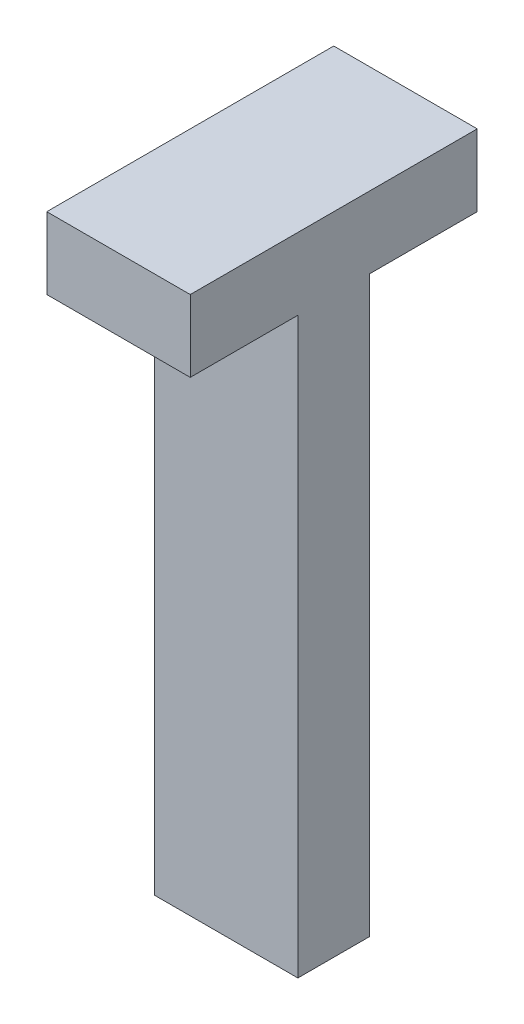
ISO-10303-21;
HEADER;
FILE_DESCRIPTION(('STEP AP214'),'2;1');
FILE_NAME('part.step','',(''),(''),'','','');
FILE_SCHEMA(('AUTOMOTIVE_DESIGN { 1 0 10303 214 1 1 1 1 }'));
ENDSEC;
DATA;
#1=APPLICATION_CONTEXT('core data for automotive mechanical design processes');
#2=APPLICATION_PROTOCOL_DEFINITION('international standard','automotive_design',2000,#1);
#3=PRODUCT_CONTEXT('',#1,'mechanical');
#4=PRODUCT('Part','Part','',(#3));
#5=PRODUCT_RELATED_PRODUCT_CATEGORY('part','',(#4));
#6=PRODUCT_DEFINITION_FORMATION('','',#4);
#7=PRODUCT_DEFINITION_CONTEXT('part definition',#1,'design');
#8=PRODUCT_DEFINITION('design','',#6,#7);
#9=PRODUCT_DEFINITION_SHAPE('','',#8);
#10=(LENGTH_UNIT() NAMED_UNIT(*) SI_UNIT(.MILLI.,.METRE.));
#11=(NAMED_UNIT(*) PLANE_ANGLE_UNIT() SI_UNIT($,.RADIAN.));
#12=(NAMED_UNIT(*) SI_UNIT($,.STERADIAN.) SOLID_ANGLE_UNIT());
#13=UNCERTAINTY_MEASURE_WITH_UNIT(LENGTH_MEASURE(1.E-05),#10,'distance_accuracy_value','');
#14=(GEOMETRIC_REPRESENTATION_CONTEXT(3) GLOBAL_UNCERTAINTY_ASSIGNED_CONTEXT((#13)) GLOBAL_UNIT_ASSIGNED_CONTEXT((#10,
#11,#12)) REPRESENTATION_CONTEXT('',''));
#15=CARTESIAN_POINT('',(0.,0.,0.));
#16=DIRECTION('',(0.,0.,1.));
#17=DIRECTION('',(1.,0.,0.));
#18=AXIS2_PLACEMENT_3D('',#15,#16,#17);
#19=CARTESIAN_POINT('',(20.,-9.99999999999999,0.));
#20=DIRECTION('',(0.,0.,1.));
#21=DIRECTION('',(1.,0.,0.));
#22=AXIS2_PLACEMENT_3D('',#19,#20,#21);
#23=PLANE('',#22);
#24=DIRECTION('',(0.,1.,0.));
#25=VECTOR('',#24,1.);
#26=CARTESIAN_POINT('',(0.,-9.99999999999999,0.));
#27=LINE('',#26,#25);
#28=CARTESIAN_POINT('',(0.,-9.99999999999999,0.));
#29=VERTEX_POINT('',#28);
#30=CARTESIAN_POINT('',(0.,0.,0.));
#31=VERTEX_POINT('',#30);
#32=EDGE_CURVE('E197',#29,#31,#27,.T.);
#33=ORIENTED_EDGE('',*,*,#32,.T.);
#34=DIRECTION('',(-1.,0.,0.));
#35=VECTOR('',#34,1.);
#36=CARTESIAN_POINT('',(20.,0.,0.));
#37=LINE('',#36,#35);
#38=CARTESIAN_POINT('',(20.,0.,0.));
#39=VERTEX_POINT('',#38);
#40=EDGE_CURVE('E12',#39,#31,#37,.T.);
#41=ORIENTED_EDGE('',*,*,#40,.F.);
#42=DIRECTION('',(0.,1.,0.));
#43=VECTOR('',#42,1.);
#44=CARTESIAN_POINT('',(20.,-9.99999999999999,0.));
#45=LINE('',#44,#43);
#46=CARTESIAN_POINT('',(20.,-9.99999999999999,0.));
#47=VERTEX_POINT('',#46);
#48=EDGE_CURVE('E170',#47,#39,#45,.T.);
#49=ORIENTED_EDGE('',*,*,#48,.F.);
#50=DIRECTION('',(-1.,0.,0.));
#51=VECTOR('',#50,1.);
#52=CARTESIAN_POINT('',(20.,-9.99999999999999,0.));
#53=LINE('',#52,#51);
#54=EDGE_CURVE('E146',#47,#29,#53,.T.);
#55=ORIENTED_EDGE('',*,*,#54,.T.);
#56=EDGE_LOOP('',(#33,#41,#49,#55));
#57=FACE_BOUND('',#56,.T.);
#58=ADVANCED_FACE('F50',(#57),#23,.F.);
#59=CARTESIAN_POINT('',(20.,0.,0.));
#60=DIRECTION('',(0.,-1.,0.));
#61=DIRECTION('',(0.,0.,-1.));
#62=AXIS2_PLACEMENT_3D('',#59,#60,#61);
#63=PLANE('',#62);
#64=DIRECTION('',(0.,0.,1.));
#65=VECTOR('',#64,1.);
#66=CARTESIAN_POINT('',(0.,0.,0.));
#67=LINE('',#66,#65);
#68=CARTESIAN_POINT('',(0.,0.,40.));
#69=VERTEX_POINT('',#68);
#70=EDGE_CURVE('E192',#31,#69,#67,.T.);
#71=ORIENTED_EDGE('',*,*,#70,.T.);
#72=DIRECTION('',(-1.,0.,0.));
#73=VECTOR('',#72,1.);
#74=CARTESIAN_POINT('',(20.,0.,40.));
#75=LINE('',#74,#73);
#76=CARTESIAN_POINT('',(20.,0.,40.));
#77=VERTEX_POINT('',#76);
#78=EDGE_CURVE('E59',#77,#69,#75,.T.);
#79=ORIENTED_EDGE('',*,*,#78,.F.);
#80=DIRECTION('',(0.,0.,1.));
#81=VECTOR('',#80,1.);
#82=CARTESIAN_POINT('',(20.,0.,0.));
#83=LINE('',#82,#81);
#84=EDGE_CURVE('E110',#39,#77,#83,.T.);
#85=ORIENTED_EDGE('',*,*,#84,.F.);
#86=ORIENTED_EDGE('',*,*,#40,.T.);
#87=EDGE_LOOP('',(#71,#79,#85,#86));
#88=FACE_BOUND('',#87,.T.);
#89=ADVANCED_FACE('F230',(#88),#63,.F.);
#90=CARTESIAN_POINT('',(20.,0.,40.));
#91=DIRECTION('',(0.,0.,-1.));
#92=DIRECTION('',(-1.,0.,0.));
#93=AXIS2_PLACEMENT_3D('',#90,#91,#92);
#94=PLANE('',#93);
#95=DIRECTION('',(0.,-1.,0.));
#96=VECTOR('',#95,1.);
#97=CARTESIAN_POINT('',(0.,0.,40.));
#98=LINE('',#97,#96);
#99=CARTESIAN_POINT('',(0.,-10.,40.));
#100=VERTEX_POINT('',#99);
#101=EDGE_CURVE('E196',#69,#100,#98,.T.);
#102=ORIENTED_EDGE('',*,*,#101,.T.);
#103=DIRECTION('',(-1.,0.,0.));
#104=VECTOR('',#103,1.);
#105=CARTESIAN_POINT('',(20.,-10.,40.));
#106=LINE('',#105,#104);
#107=CARTESIAN_POINT('',(20.,-10.,40.));
#108=VERTEX_POINT('',#107);
#109=EDGE_CURVE('E182',#108,#100,#106,.T.);
#110=ORIENTED_EDGE('',*,*,#109,.F.);
#111=DIRECTION('',(0.,-1.,0.));
#112=VECTOR('',#111,1.);
#113=CARTESIAN_POINT('',(20.,0.,40.));
#114=LINE('',#113,#112);
#115=EDGE_CURVE('E310',#77,#108,#114,.T.);
#116=ORIENTED_EDGE('',*,*,#115,.F.);
#117=ORIENTED_EDGE('',*,*,#78,.T.);
#118=EDGE_LOOP('',(#102,#110,#116,#117));
#119=FACE_BOUND('',#118,.T.);
#120=ADVANCED_FACE('F234',(#119),#94,.F.);
#121=CARTESIAN_POINT('',(20.,-10.,40.));
#122=DIRECTION('',(0.,1.,0.));
#123=DIRECTION('',(0.,0.,1.));
#124=AXIS2_PLACEMENT_3D('',#121,#122,#123);
#125=PLANE('',#124);
#126=DIRECTION('',(0.,0.,-1.));
#127=VECTOR('',#126,1.);
#128=CARTESIAN_POINT('',(0.,-10.,40.));
#129=LINE('',#128,#127);
#130=CARTESIAN_POINT('',(0.,-10.,25.));
#131=VERTEX_POINT('',#130);
#132=EDGE_CURVE('E199',#100,#131,#129,.T.);
#133=ORIENTED_EDGE('',*,*,#132,.T.);
#134=DIRECTION('',(-1.,0.,0.));
#135=VECTOR('',#134,1.);
#136=CARTESIAN_POINT('',(20.,-10.,25.));
#137=LINE('',#136,#135);
#138=CARTESIAN_POINT('',(20.,-10.,25.));
#139=VERTEX_POINT('',#138);
#140=EDGE_CURVE('E178',#139,#131,#137,.T.);
#141=ORIENTED_EDGE('',*,*,#140,.F.);
#142=DIRECTION('',(0.,0.,-1.));
#143=VECTOR('',#142,1.);
#144=CARTESIAN_POINT('',(20.,-10.,40.));
#145=LINE('',#144,#143);
#146=EDGE_CURVE('E313',#108,#139,#145,.T.);
#147=ORIENTED_EDGE('',*,*,#146,.F.);
#148=ORIENTED_EDGE('',*,*,#109,.T.);
#149=EDGE_LOOP('',(#133,#141,#147,#148));
#150=FACE_BOUND('',#149,.T.);
#151=ADVANCED_FACE('F238',(#150),#125,.F.);
#152=CARTESIAN_POINT('',(20.,-10.,25.));
#153=DIRECTION('',(0.,0.,-1.));
#154=DIRECTION('',(-1.,0.,0.));
#155=AXIS2_PLACEMENT_3D('',#152,#153,#154);
#156=PLANE('',#155);
#157=DIRECTION('',(0.,-1.,0.));
#158=VECTOR('',#157,1.);
#159=CARTESIAN_POINT('',(0.,-10.,25.));
#160=LINE('',#159,#158);
#161=CARTESIAN_POINT('',(0.,-90.,25.));
#162=VERTEX_POINT('',#161);
#163=EDGE_CURVE('E163',#131,#162,#160,.T.);
#164=ORIENTED_EDGE('',*,*,#163,.T.);
#165=DIRECTION('',(-1.,0.,0.));
#166=VECTOR('',#165,1.);
#167=CARTESIAN_POINT('',(20.,-90.,25.));
#168=LINE('',#167,#166);
#169=CARTESIAN_POINT('',(20.,-90.,25.));
#170=VERTEX_POINT('',#169);
#171=EDGE_CURVE('E139',#170,#162,#168,.T.);
#172=ORIENTED_EDGE('',*,*,#171,.F.);
#173=DIRECTION('',(0.,-1.,0.));
#174=VECTOR('',#173,1.);
#175=CARTESIAN_POINT('',(20.,-10.,25.));
#176=LINE('',#175,#174);
#177=EDGE_CURVE('E129',#139,#170,#176,.T.);
#178=ORIENTED_EDGE('',*,*,#177,.F.);
#179=ORIENTED_EDGE('',*,*,#140,.T.);
#180=EDGE_LOOP('',(#164,#172,#178,#179));
#181=FACE_BOUND('',#180,.T.);
#182=ADVANCED_FACE('F207',(#181),#156,.F.);
#183=CARTESIAN_POINT('',(20.,-90.,25.));
#184=DIRECTION('',(0.,1.,0.));
#185=DIRECTION('',(0.,0.,1.));
#186=AXIS2_PLACEMENT_3D('',#183,#184,#185);
#187=PLANE('',#186);
#188=DIRECTION('',(0.,0.,-1.));
#189=VECTOR('',#188,1.);
#190=CARTESIAN_POINT('',(0.,-90.,25.));
#191=LINE('',#190,#189);
#192=CARTESIAN_POINT('',(0.,-90.,15.));
#193=VERTEX_POINT('',#192);
#194=EDGE_CURVE('E137',#162,#193,#191,.T.);
#195=ORIENTED_EDGE('',*,*,#194,.T.);
#196=DIRECTION('',(-1.,0.,0.));
#197=VECTOR('',#196,1.);
#198=CARTESIAN_POINT('',(20.,-90.,15.));
#199=LINE('',#198,#197);
#200=CARTESIAN_POINT('',(20.,-90.,15.));
#201=VERTEX_POINT('',#200);
#202=EDGE_CURVE('E134',#201,#193,#199,.T.);
#203=ORIENTED_EDGE('',*,*,#202,.F.);
#204=DIRECTION('',(0.,0.,-1.));
#205=VECTOR('',#204,1.);
#206=CARTESIAN_POINT('',(20.,-90.,25.));
#207=LINE('',#206,#205);
#208=EDGE_CURVE('E123',#170,#201,#207,.T.);
#209=ORIENTED_EDGE('',*,*,#208,.F.);
#210=ORIENTED_EDGE('',*,*,#171,.T.);
#211=EDGE_LOOP('',(#195,#203,#209,#210));
#212=FACE_BOUND('',#211,.T.);
#213=ADVANCED_FACE('F135',(#212),#187,.F.);
#214=CARTESIAN_POINT('',(20.,-90.,15.));
#215=DIRECTION('',(0.,0.,1.));
#216=DIRECTION('',(1.,0.,0.));
#217=AXIS2_PLACEMENT_3D('',#214,#215,#216);
#218=PLANE('',#217);
#219=DIRECTION('',(0.,1.,0.));
#220=VECTOR('',#219,1.);
#221=CARTESIAN_POINT('',(0.,-90.,15.));
#222=LINE('',#221,#220);
#223=CARTESIAN_POINT('',(0.,-10.,15.));
#224=VERTEX_POINT('',#223);
#225=EDGE_CURVE('E96',#193,#224,#222,.T.);
#226=ORIENTED_EDGE('',*,*,#225,.T.);
#227=DIRECTION('',(-1.,0.,0.));
#228=VECTOR('',#227,1.);
#229=CARTESIAN_POINT('',(20.,-10.,15.));
#230=LINE('',#229,#228);
#231=CARTESIAN_POINT('',(20.,-10.,15.));
#232=VERTEX_POINT('',#231);
#233=EDGE_CURVE('E140',#232,#224,#230,.T.);
#234=ORIENTED_EDGE('',*,*,#233,.F.);
#235=DIRECTION('',(0.,1.,0.));
#236=VECTOR('',#235,1.);
#237=CARTESIAN_POINT('',(20.,-90.,15.));
#238=LINE('',#237,#236);
#239=EDGE_CURVE('E127',#201,#232,#238,.T.);
#240=ORIENTED_EDGE('',*,*,#239,.F.);
#241=ORIENTED_EDGE('',*,*,#202,.T.);
#242=EDGE_LOOP('',(#226,#234,#240,#241));
#243=FACE_BOUND('',#242,.T.);
#244=ADVANCED_FACE('F142',(#243),#218,.F.);
#245=CARTESIAN_POINT('',(20.,-10.,15.));
#246=DIRECTION('',(0.,1.,0.));
#247=DIRECTION('',(0.,0.,1.));
#248=AXIS2_PLACEMENT_3D('',#245,#246,#247);
#249=PLANE('',#248);
#250=DIRECTION('',(0.,0.,-1.));
#251=VECTOR('',#250,1.);
#252=CARTESIAN_POINT('',(0.,-10.,15.));
#253=LINE('',#252,#251);
#254=EDGE_CURVE('E102',#224,#29,#253,.T.);
#255=ORIENTED_EDGE('',*,*,#254,.T.);
#256=ORIENTED_EDGE('',*,*,#54,.F.);
#257=DIRECTION('',(0.,0.,-1.));
#258=VECTOR('',#257,1.);
#259=CARTESIAN_POINT('',(20.,-10.,15.));
#260=LINE('',#259,#258);
#261=EDGE_CURVE('E67',#232,#47,#260,.T.);
#262=ORIENTED_EDGE('',*,*,#261,.F.);
#263=ORIENTED_EDGE('',*,*,#233,.T.);
#264=EDGE_LOOP('',(#255,#256,#262,#263));
#265=FACE_BOUND('',#264,.T.);
#266=ADVANCED_FACE('F217',(#265),#249,.F.);
#267=CARTESIAN_POINT('',(20.,0.,0.));
#268=DIRECTION('',(1.,0.,0.));
#269=DIRECTION('',(0.,0.,-1.));
#270=AXIS2_PLACEMENT_3D('',#267,#268,#269);
#271=PLANE('',#270);
#272=ORIENTED_EDGE('',*,*,#48,.T.);
#273=ORIENTED_EDGE('',*,*,#84,.T.);
#274=ORIENTED_EDGE('',*,*,#115,.T.);
#275=ORIENTED_EDGE('',*,*,#146,.T.);
#276=ORIENTED_EDGE('',*,*,#177,.T.);
#277=ORIENTED_EDGE('',*,*,#208,.T.);
#278=ORIENTED_EDGE('',*,*,#239,.T.);
#279=ORIENTED_EDGE('',*,*,#261,.T.);
#280=EDGE_LOOP('',(#272,#273,#274,#275,#276,#277,#278,#279));
#281=FACE_BOUND('',#280,.T.);
#282=ADVANCED_FACE('F125',(#281),#271,.T.);
#283=CARTESIAN_POINT('',(0.,0.,0.));
#284=DIRECTION('',(1.,0.,0.));
#285=DIRECTION('',(0.,0.,-1.));
#286=AXIS2_PLACEMENT_3D('',#283,#284,#285);
#287=PLANE('',#286);
#288=ORIENTED_EDGE('',*,*,#32,.F.);
#289=ORIENTED_EDGE('',*,*,#254,.F.);
#290=ORIENTED_EDGE('',*,*,#225,.F.);
#291=ORIENTED_EDGE('',*,*,#194,.F.);
#292=ORIENTED_EDGE('',*,*,#163,.F.);
#293=ORIENTED_EDGE('',*,*,#132,.F.);
#294=ORIENTED_EDGE('',*,*,#101,.F.);
#295=ORIENTED_EDGE('',*,*,#70,.F.);
#296=EDGE_LOOP('',(#288,#289,#290,#291,#292,#293,#294,#295));
#297=FACE_BOUND('',#296,.T.);
#298=ADVANCED_FACE('F210',(#297),#287,.F.);
#299=CLOSED_SHELL('',(#58,#89,#120,#151,#182,#213,#244,#266,#282,#298));
#300=MANIFOLD_SOLID_BREP('B2',#299);
#301=ADVANCED_BREP_SHAPE_REPRESENTATION('',(#18,#300),#14);
#302=SHAPE_DEFINITION_REPRESENTATION(#9,#301);
ENDSEC;
END-ISO-10303-21;
